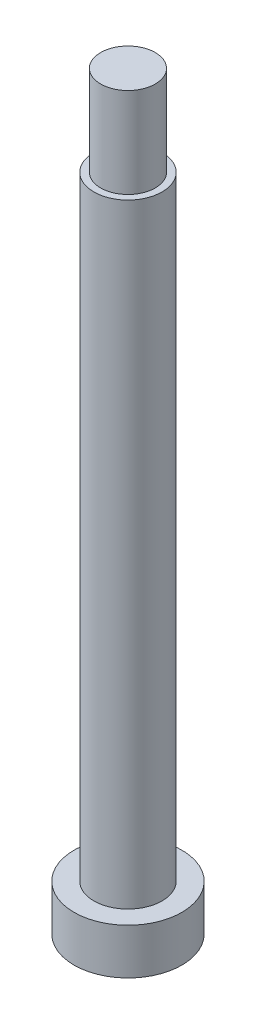
ISO-10303-21;
HEADER;
FILE_DESCRIPTION(('STEP AP214'),'2;1');
FILE_NAME('part.step','',(''),(''),'','','');
FILE_SCHEMA(('AUTOMOTIVE_DESIGN { 1 0 10303 214 1 1 1 1 }'));
ENDSEC;
DATA;
#1=APPLICATION_CONTEXT('core data for automotive mechanical design processes');
#2=APPLICATION_PROTOCOL_DEFINITION('international standard','automotive_design',2000,#1);
#3=PRODUCT_CONTEXT('',#1,'mechanical');
#4=PRODUCT('Part','Part','',(#3));
#5=PRODUCT_RELATED_PRODUCT_CATEGORY('part','',(#4));
#6=PRODUCT_DEFINITION_FORMATION('','',#4);
#7=PRODUCT_DEFINITION_CONTEXT('part definition',#1,'design');
#8=PRODUCT_DEFINITION('design','',#6,#7);
#9=PRODUCT_DEFINITION_SHAPE('','',#8);
#10=(LENGTH_UNIT() NAMED_UNIT(*) SI_UNIT(.MILLI.,.METRE.));
#11=(NAMED_UNIT(*) PLANE_ANGLE_UNIT() SI_UNIT($,.RADIAN.));
#12=(NAMED_UNIT(*) SI_UNIT($,.STERADIAN.) SOLID_ANGLE_UNIT());
#13=UNCERTAINTY_MEASURE_WITH_UNIT(LENGTH_MEASURE(1.E-05),#10,'distance_accuracy_value','');
#14=(GEOMETRIC_REPRESENTATION_CONTEXT(3) GLOBAL_UNCERTAINTY_ASSIGNED_CONTEXT((#13)) GLOBAL_UNIT_ASSIGNED_CONTEXT((#10,
#11,#12)) REPRESENTATION_CONTEXT('',''));
#15=CARTESIAN_POINT('',(0.,0.,0.));
#16=DIRECTION('',(0.,0.,1.));
#17=DIRECTION('',(1.,0.,0.));
#18=AXIS2_PLACEMENT_3D('',#15,#16,#17);
#19=CARTESIAN_POINT('',(0.,109.9,0.));
#20=DIRECTION('',(0.,-1.,0.));
#21=DIRECTION('',(0.,0.,-1.));
#22=AXIS2_PLACEMENT_3D('',#19,#20,#21);
#23=CYLINDRICAL_SURFACE('',#22,4.);
#24=CARTESIAN_POINT('',(0.,96.7,0.));
#25=DIRECTION('',(0.,1.,0.));
#26=DIRECTION('',(0.,0.,1.));
#27=AXIS2_PLACEMENT_3D('',#24,#25,#26);
#28=CIRCLE('',#27,4.);
#29=CARTESIAN_POINT('',(0.,96.7,-4.));
#30=VERTEX_POINT('',#29);
#31=EDGE_CURVE('E158',#30,#30,#28,.T.);
#32=CARTESIAN_POINT('',(0.,109.9,0.));
#33=DIRECTION('',(0.,1.,0.));
#34=DIRECTION('',(0.,0.,1.));
#35=AXIS2_PLACEMENT_3D('',#32,#33,#34);
#36=CIRCLE('',#35,4.);
#37=CARTESIAN_POINT('',(0.,109.9,-4.));
#38=VERTEX_POINT('',#37);
#39=EDGE_CURVE('E12',#38,#38,#36,.T.);
#40=CARTESIAN_POINT('',(0.,96.7,-4.));
#41=CARTESIAN_POINT('',(0.,96.8375,-4.));
#42=CARTESIAN_POINT('',(0.,96.975,-4.));
#43=CARTESIAN_POINT('',(0.,97.25,-4.));
#44=CARTESIAN_POINT('',(0.,97.3875,-4.));
#45=CARTESIAN_POINT('',(0.,97.6625,-4.));
#46=CARTESIAN_POINT('',(0.,97.8,-4.));
#47=CARTESIAN_POINT('',(0.,98.075,-4.));
#48=CARTESIAN_POINT('',(0.,98.2125,-4.));
#49=CARTESIAN_POINT('',(0.,98.4875,-4.));
#50=CARTESIAN_POINT('',(0.,98.625,-4.));
#51=CARTESIAN_POINT('',(0.,98.9,-4.));
#52=CARTESIAN_POINT('',(0.,99.0375,-4.));
#53=CARTESIAN_POINT('',(0.,99.3125,-4.));
#54=CARTESIAN_POINT('',(0.,99.45,-4.));
#55=CARTESIAN_POINT('',(0.,99.725,-4.));
#56=CARTESIAN_POINT('',(0.,99.8625,-4.));
#57=CARTESIAN_POINT('',(0.,100.1375,-4.));
#58=CARTESIAN_POINT('',(0.,100.275,-4.));
#59=CARTESIAN_POINT('',(0.,100.55,-4.));
#60=CARTESIAN_POINT('',(0.,100.6875,-4.));
#61=CARTESIAN_POINT('',(0.,100.9625,-4.));
#62=CARTESIAN_POINT('',(0.,101.1,-4.));
#63=CARTESIAN_POINT('',(0.,101.375,-4.));
#64=CARTESIAN_POINT('',(0.,101.5125,-4.));
#65=CARTESIAN_POINT('',(0.,101.7875,-4.));
#66=CARTESIAN_POINT('',(0.,101.925,-4.));
#67=CARTESIAN_POINT('',(0.,102.2,-4.));
#68=CARTESIAN_POINT('',(0.,102.3375,-4.));
#69=CARTESIAN_POINT('',(0.,102.6125,-4.));
#70=CARTESIAN_POINT('',(0.,102.75,-4.));
#71=CARTESIAN_POINT('',(0.,103.025,-4.));
#72=CARTESIAN_POINT('',(0.,103.1625,-4.));
#73=CARTESIAN_POINT('',(0.,103.4375,-4.));
#74=CARTESIAN_POINT('',(0.,103.575,-4.));
#75=CARTESIAN_POINT('',(0.,103.85,-4.));
#76=CARTESIAN_POINT('',(0.,103.9875,-4.));
#77=CARTESIAN_POINT('',(0.,104.2625,-4.));
#78=CARTESIAN_POINT('',(0.,104.4,-4.));
#79=CARTESIAN_POINT('',(0.,104.675,-4.));
#80=CARTESIAN_POINT('',(0.,104.8125,-4.));
#81=CARTESIAN_POINT('',(0.,105.0875,-4.));
#82=CARTESIAN_POINT('',(0.,105.225,-4.));
#83=CARTESIAN_POINT('',(0.,105.5,-4.));
#84=CARTESIAN_POINT('',(0.,105.6375,-4.));
#85=CARTESIAN_POINT('',(0.,105.9125,-4.));
#86=CARTESIAN_POINT('',(0.,106.05,-4.));
#87=CARTESIAN_POINT('',(0.,106.325,-4.));
#88=CARTESIAN_POINT('',(0.,106.4625,-4.));
#89=CARTESIAN_POINT('',(0.,106.7375,-4.));
#90=CARTESIAN_POINT('',(0.,106.875,-4.));
#91=CARTESIAN_POINT('',(0.,107.15,-4.));
#92=CARTESIAN_POINT('',(0.,107.2875,-4.));
#93=CARTESIAN_POINT('',(0.,107.5625,-4.));
#94=CARTESIAN_POINT('',(0.,107.7,-4.));
#95=CARTESIAN_POINT('',(0.,107.975,-4.));
#96=CARTESIAN_POINT('',(0.,108.1125,-4.));
#97=CARTESIAN_POINT('',(0.,108.3875,-4.));
#98=CARTESIAN_POINT('',(0.,108.525,-4.));
#99=CARTESIAN_POINT('',(0.,108.8,-4.));
#100=CARTESIAN_POINT('',(0.,108.9375,-4.));
#101=CARTESIAN_POINT('',(0.,109.2125,-4.));
#102=CARTESIAN_POINT('',(0.,109.35,-4.));
#103=CARTESIAN_POINT('',(0.,109.625,-4.));
#104=CARTESIAN_POINT('',(0.,109.7625,-4.));
#105=CARTESIAN_POINT('',(0.,109.9,-4.));
#106=B_SPLINE_CURVE_WITH_KNOTS('',3,(#40,#41,#42,#43,#44,#45,#46,#47,#48,#49,#50,#51,#52,#53,
#54,#55,#56,#57,#58,#59,#60,#61,#62,#63,#64,#65,#66,#67,#68,#69,#70,#71,#72,#73,#74,#75,#76,#77,
#78,#79,#80,#81,#82,#83,#84,#85,#86,#87,#88,#89,#90,#91,#92,#93,#94,#95,#96,#97,#98,#99,#100,
#101,#102,#103,#104,#105),.UNSPECIFIED.,.F.,.F.,(4,2,2,2,2,2,2,2,2,2,2,2,2,2,2,2,2,2,2,2,2,2,2,
2,2,2,2,2,2,2,2,2,4),(0.,0.41250000000001,0.825000000000006,1.2375,1.65,2.06250000000001,2.475,
2.8875,3.30000000000001,3.71250000000001,4.125,4.53750000000001,4.95000000000001,
5.36250000000001,5.775,6.18750000000001,6.60000000000001,7.0125,7.425,7.83750000000001,
8.25000000000001,8.6625,9.07500000000001,9.48750000000001,9.90000000000001,10.3125,10.725,
11.1375,11.55,11.9625,12.375,12.7875,13.2),.UNSPECIFIED.);
#107=EDGE_CURVE('BSEAM50',#30,#38,#106,.T.);
#108=ORIENTED_EDGE('',*,*,#31,.T.);
#109=ORIENTED_EDGE('',*,*,#39,.F.);
#110=ORIENTED_EDGE('',*,*,#107,.T.);
#111=ORIENTED_EDGE('',*,*,#107,.F.);
#112=EDGE_LOOP('',(#108,#110,#109,#111));
#113=FACE_BOUND('',#112,.T.);
#114=ADVANCED_FACE('F50',(#113),#23,.T.);
#115=CARTESIAN_POINT('',(0.,109.9,0.));
#116=DIRECTION('',(0.,1.,0.));
#117=DIRECTION('',(0.,0.,1.));
#118=AXIS2_PLACEMENT_3D('',#115,#116,#117);
#119=PLANE('',#118);
#120=ORIENTED_EDGE('',*,*,#39,.T.);
#121=EDGE_LOOP('',(#120));
#122=FACE_BOUND('',#121,.T.);
#123=ADVANCED_FACE('F171',(#122),#119,.T.);
#124=CARTESIAN_POINT('',(0.,96.7,0.));
#125=DIRECTION('',(0.,-1.,0.));
#126=DIRECTION('',(0.,0.,-1.));
#127=AXIS2_PLACEMENT_3D('',#124,#125,#126);
#128=CYLINDRICAL_SURFACE('',#127,5.);
#129=CARTESIAN_POINT('',(0.,6.7,0.));
#130=DIRECTION('',(0.,1.,0.));
#131=DIRECTION('',(0.,0.,1.));
#132=AXIS2_PLACEMENT_3D('',#129,#130,#131);
#133=CIRCLE('',#132,5.);
#134=CARTESIAN_POINT('',(0.,6.7,5.));
#135=VERTEX_POINT('',#134);
#136=EDGE_CURVE('E153',#135,#135,#133,.T.);
#137=ORIENTED_EDGE('',*,*,#136,.T.);
#138=EDGE_LOOP('',(#137));
#139=FACE_BOUND('',#138,.T.);
#140=CARTESIAN_POINT('',(0.,96.7,0.));
#141=DIRECTION('',(0.,1.,0.));
#142=DIRECTION('',(0.,0.,1.));
#143=AXIS2_PLACEMENT_3D('',#140,#141,#142);
#144=CIRCLE('',#143,5.);
#145=CARTESIAN_POINT('',(0.,96.7,5.));
#146=VERTEX_POINT('',#145);
#147=EDGE_CURVE('E53',#146,#146,#144,.T.);
#148=ORIENTED_EDGE('',*,*,#147,.F.);
#149=EDGE_LOOP('',(#148));
#150=FACE_BOUND('',#149,.T.);
#151=ADVANCED_FACE('F169',(#139,#150),#128,.T.);
#152=CARTESIAN_POINT('',(0.,96.7,0.));
#153=DIRECTION('',(0.,1.,0.));
#154=DIRECTION('',(0.,0.,1.));
#155=AXIS2_PLACEMENT_3D('',#152,#153,#154);
#156=PLANE('',#155);
#157=ORIENTED_EDGE('',*,*,#31,.F.);
#158=EDGE_LOOP('',(#157));
#159=FACE_BOUND('',#158,.T.);
#160=ORIENTED_EDGE('',*,*,#147,.T.);
#161=EDGE_LOOP('',(#160));
#162=FACE_BOUND('',#161,.T.);
#163=ADVANCED_FACE('F170',(#159,#162),#156,.T.);
#164=CARTESIAN_POINT('',(0.,6.7,0.));
#165=DIRECTION('',(0.,-1.,0.));
#166=DIRECTION('',(0.,0.,-1.));
#167=AXIS2_PLACEMENT_3D('',#164,#165,#166);
#168=CYLINDRICAL_SURFACE('',#167,7.9);
#169=CARTESIAN_POINT('',(0.,6.7,0.));
#170=DIRECTION('',(0.,1.,0.));
#171=DIRECTION('',(0.,0.,1.));
#172=AXIS2_PLACEMENT_3D('',#169,#170,#171);
#173=CIRCLE('',#172,7.9);
#174=CARTESIAN_POINT('',(0.,6.7,7.9));
#175=VERTEX_POINT('',#174);
#176=EDGE_CURVE('E160',#175,#175,#173,.T.);
#177=ORIENTED_EDGE('',*,*,#176,.F.);
#178=EDGE_LOOP('',(#177));
#179=FACE_BOUND('',#178,.T.);
#180=CARTESIAN_POINT('',(0.,0.,0.));
#181=DIRECTION('',(0.,1.,0.));
#182=DIRECTION('',(0.,0.,1.));
#183=AXIS2_PLACEMENT_3D('',#180,#181,#182);
#184=CIRCLE('',#183,7.9);
#185=CARTESIAN_POINT('',(0.,0.,7.9));
#186=VERTEX_POINT('',#185);
#187=EDGE_CURVE('E150',#186,#186,#184,.T.);
#188=ORIENTED_EDGE('',*,*,#187,.T.);
#189=EDGE_LOOP('',(#188));
#190=FACE_BOUND('',#189,.T.);
#191=ADVANCED_FACE('F178',(#179,#190),#168,.T.);
#192=CARTESIAN_POINT('',(0.,6.7,0.));
#193=DIRECTION('',(0.,1.,0.));
#194=DIRECTION('',(0.,0.,1.));
#195=AXIS2_PLACEMENT_3D('',#192,#193,#194);
#196=PLANE('',#195);
#197=ORIENTED_EDGE('',*,*,#136,.F.);
#198=EDGE_LOOP('',(#197));
#199=FACE_BOUND('',#198,.T.);
#200=ORIENTED_EDGE('',*,*,#176,.T.);
#201=EDGE_LOOP('',(#200));
#202=FACE_BOUND('',#201,.T.);
#203=ADVANCED_FACE('F212',(#199,#202),#196,.T.);
#204=CARTESIAN_POINT('',(0.,0.,0.));
#205=DIRECTION('',(0.,1.,0.));
#206=DIRECTION('',(0.,0.,1.));
#207=AXIS2_PLACEMENT_3D('',#204,#205,#206);
#208=PLANE('',#207);
#209=DIRECTION('',(-0.866025403784439,0.,0.5));
#210=VECTOR('',#209,1.);
#211=CARTESIAN_POINT('',(2.5,0.,1.44337567297406));
#212=LINE('',#211,#210);
#213=CARTESIAN_POINT('',(2.5,0.,1.44337567297406));
#214=VERTEX_POINT('',#213);
#215=CARTESIAN_POINT('',(0.,0.,2.88675134594813));
#216=VERTEX_POINT('',#215);
#217=EDGE_CURVE('E132',#214,#216,#212,.T.);
#218=ORIENTED_EDGE('',*,*,#217,.F.);
#219=DIRECTION('',(0.,0.,1.));
#220=VECTOR('',#219,1.);
#221=CARTESIAN_POINT('',(2.5,0.,-1.44337567297406));
#222=LINE('',#221,#220);
#223=CARTESIAN_POINT('',(2.5,0.,-1.44337567297406));
#224=VERTEX_POINT('',#223);
#225=EDGE_CURVE('E64',#224,#214,#222,.T.);
#226=ORIENTED_EDGE('',*,*,#225,.F.);
#227=DIRECTION('',(0.866025403784439,0.,0.5));
#228=VECTOR('',#227,1.);
#229=CARTESIAN_POINT('',(0.,0.,-2.88675134594813));
#230=LINE('',#229,#228);
#231=CARTESIAN_POINT('',(0.,0.,-2.88675134594813));
#232=VERTEX_POINT('',#231);
#233=EDGE_CURVE('E144',#232,#224,#230,.T.);
#234=ORIENTED_EDGE('',*,*,#233,.F.);
#235=DIRECTION('',(0.866025403784439,0.,-0.5));
#236=VECTOR('',#235,1.);
#237=CARTESIAN_POINT('',(-2.5,0.,-1.44337567297407));
#238=LINE('',#237,#236);
#239=CARTESIAN_POINT('',(-2.5,0.,-1.44337567297407));
#240=VERTEX_POINT('',#239);
#241=EDGE_CURVE('E145',#240,#232,#238,.T.);
#242=ORIENTED_EDGE('',*,*,#241,.F.);
#243=DIRECTION('',(0.,0.,-1.));
#244=VECTOR('',#243,1.);
#245=CARTESIAN_POINT('',(-2.5,0.,1.44337567297406));
#246=LINE('',#245,#244);
#247=CARTESIAN_POINT('',(-2.5,0.,1.44337567297406));
#248=VERTEX_POINT('',#247);
#249=EDGE_CURVE('E107',#248,#240,#246,.T.);
#250=ORIENTED_EDGE('',*,*,#249,.F.);
#251=DIRECTION('',(-0.866025403784439,0.,-0.5));
#252=VECTOR('',#251,1.);
#253=CARTESIAN_POINT('',(0.,0.,2.88675134594813));
#254=LINE('',#253,#252);
#255=EDGE_CURVE('E139',#216,#248,#254,.T.);
#256=ORIENTED_EDGE('',*,*,#255,.F.);
#257=EDGE_LOOP('',(#218,#226,#234,#242,#250,#256));
#258=FACE_BOUND('',#257,.T.);
#259=ORIENTED_EDGE('',*,*,#187,.F.);
#260=EDGE_LOOP('',(#259));
#261=FACE_BOUND('',#260,.T.);
#262=ADVANCED_FACE('F206',(#258,#261),#208,.F.);
#263=CARTESIAN_POINT('',(2.5,3.,-1.44337567297406));
#264=DIRECTION('',(1.,0.,0.));
#265=DIRECTION('',(0.,0.,-1.));
#266=AXIS2_PLACEMENT_3D('',#263,#264,#265);
#267=PLANE('',#266);
#268=ORIENTED_EDGE('',*,*,#225,.T.);
#269=DIRECTION('',(0.,-1.,0.));
#270=VECTOR('',#269,1.);
#271=CARTESIAN_POINT('',(2.5,3.,1.44337567297406));
#272=LINE('',#271,#270);
#273=CARTESIAN_POINT('',(2.5,3.,1.44337567297406));
#274=VERTEX_POINT('',#273);
#275=EDGE_CURVE('E92',#274,#214,#272,.T.);
#276=ORIENTED_EDGE('',*,*,#275,.F.);
#277=DIRECTION('',(0.,0.,1.));
#278=VECTOR('',#277,1.);
#279=CARTESIAN_POINT('',(2.5,3.,-1.44337567297406));
#280=LINE('',#279,#278);
#281=CARTESIAN_POINT('',(2.5,3.,-1.44337567297406));
#282=VERTEX_POINT('',#281);
#283=EDGE_CURVE('E149',#282,#274,#280,.T.);
#284=ORIENTED_EDGE('',*,*,#283,.F.);
#285=DIRECTION('',(0.,-1.,0.));
#286=VECTOR('',#285,1.);
#287=CARTESIAN_POINT('',(2.5,3.,-1.44337567297406));
#288=LINE('',#287,#286);
#289=EDGE_CURVE('E68',#282,#224,#288,.T.);
#290=ORIENTED_EDGE('',*,*,#289,.T.);
#291=EDGE_LOOP('',(#268,#276,#284,#290));
#292=FACE_BOUND('',#291,.T.);
#293=ADVANCED_FACE('F213',(#292),#267,.F.);
#294=CARTESIAN_POINT('',(0.,3.,-2.88675134594813));
#295=DIRECTION('',(0.5,0.,-0.866025403784439));
#296=DIRECTION('',(-0.866025403784439,0.,-0.5));
#297=AXIS2_PLACEMENT_3D('',#294,#295,#296);
#298=PLANE('',#297);
#299=ORIENTED_EDGE('',*,*,#233,.T.);
#300=ORIENTED_EDGE('',*,*,#289,.F.);
#301=DIRECTION('',(0.866025403784439,0.,0.5));
#302=VECTOR('',#301,1.);
#303=CARTESIAN_POINT('',(0.,3.,-2.88675134594813));
#304=LINE('',#303,#302);
#305=CARTESIAN_POINT('',(0.,3.,-2.88675134594813));
#306=VERTEX_POINT('',#305);
#307=EDGE_CURVE('E122',#306,#282,#304,.T.);
#308=ORIENTED_EDGE('',*,*,#307,.F.);
#309=DIRECTION('',(0.,-1.,0.));
#310=VECTOR('',#309,1.);
#311=CARTESIAN_POINT('',(0.,3.,-2.88675134594813));
#312=LINE('',#311,#310);
#313=EDGE_CURVE('E113',#306,#232,#312,.T.);
#314=ORIENTED_EDGE('',*,*,#313,.T.);
#315=EDGE_LOOP('',(#299,#300,#308,#314));
#316=FACE_BOUND('',#315,.T.);
#317=ADVANCED_FACE('F243',(#316),#298,.F.);
#318=CARTESIAN_POINT('',(-2.5,3.,-1.44337567297407));
#319=DIRECTION('',(-0.5,0.,-0.866025403784439));
#320=DIRECTION('',(-0.866025403784439,0.,0.5));
#321=AXIS2_PLACEMENT_3D('',#318,#319,#320);
#322=PLANE('',#321);
#323=ORIENTED_EDGE('',*,*,#241,.T.);
#324=ORIENTED_EDGE('',*,*,#313,.F.);
#325=DIRECTION('',(0.866025403784439,0.,-0.5));
#326=VECTOR('',#325,1.);
#327=CARTESIAN_POINT('',(-2.5,3.,-1.44337567297407));
#328=LINE('',#327,#326);
#329=CARTESIAN_POINT('',(-2.5,3.,-1.44337567297407));
#330=VERTEX_POINT('',#329);
#331=EDGE_CURVE('E120',#330,#306,#328,.T.);
#332=ORIENTED_EDGE('',*,*,#331,.F.);
#333=DIRECTION('',(0.,-1.,0.));
#334=VECTOR('',#333,1.);
#335=CARTESIAN_POINT('',(-2.5,3.,-1.44337567297407));
#336=LINE('',#335,#334);
#337=EDGE_CURVE('E105',#330,#240,#336,.T.);
#338=ORIENTED_EDGE('',*,*,#337,.T.);
#339=EDGE_LOOP('',(#323,#324,#332,#338));
#340=FACE_BOUND('',#339,.T.);
#341=ADVANCED_FACE('F117',(#340),#322,.F.);
#342=CARTESIAN_POINT('',(-2.5,3.,1.44337567297406));
#343=DIRECTION('',(-1.,0.,0.));
#344=DIRECTION('',(0.,0.,1.));
#345=AXIS2_PLACEMENT_3D('',#342,#343,#344);
#346=PLANE('',#345);
#347=ORIENTED_EDGE('',*,*,#249,.T.);
#348=ORIENTED_EDGE('',*,*,#337,.F.);
#349=DIRECTION('',(0.,0.,-1.));
#350=VECTOR('',#349,1.);
#351=CARTESIAN_POINT('',(-2.5,3.,1.44337567297406));
#352=LINE('',#351,#350);
#353=CARTESIAN_POINT('',(-2.5,3.,1.44337567297406));
#354=VERTEX_POINT('',#353);
#355=EDGE_CURVE('E106',#354,#330,#352,.T.);
#356=ORIENTED_EDGE('',*,*,#355,.F.);
#357=DIRECTION('',(0.,-1.,0.));
#358=VECTOR('',#357,1.);
#359=CARTESIAN_POINT('',(-2.5,3.,1.44337567297406));
#360=LINE('',#359,#358);
#361=EDGE_CURVE('E112',#354,#248,#360,.T.);
#362=ORIENTED_EDGE('',*,*,#361,.T.);
#363=EDGE_LOOP('',(#347,#348,#356,#362));
#364=FACE_BOUND('',#363,.T.);
#365=ADVANCED_FACE('F104',(#364),#346,.F.);
#366=CARTESIAN_POINT('',(0.,3.,2.88675134594813));
#367=DIRECTION('',(-0.5,0.,0.866025403784438));
#368=DIRECTION('',(0.866025403784439,0.,0.5));
#369=AXIS2_PLACEMENT_3D('',#366,#367,#368);
#370=PLANE('',#369);
#371=ORIENTED_EDGE('',*,*,#255,.T.);
#372=ORIENTED_EDGE('',*,*,#361,.F.);
#373=DIRECTION('',(-0.866025403784439,0.,-0.5));
#374=VECTOR('',#373,1.);
#375=CARTESIAN_POINT('',(0.,3.,2.88675134594813));
#376=LINE('',#375,#374);
#377=CARTESIAN_POINT('',(0.,3.,2.88675134594813));
#378=VERTEX_POINT('',#377);
#379=EDGE_CURVE('E126',#378,#354,#376,.T.);
#380=ORIENTED_EDGE('',*,*,#379,.F.);
#381=DIRECTION('',(0.,-1.,0.));
#382=VECTOR('',#381,1.);
#383=CARTESIAN_POINT('',(0.,3.,2.88675134594813));
#384=LINE('',#383,#382);
#385=EDGE_CURVE('E154',#378,#216,#384,.T.);
#386=ORIENTED_EDGE('',*,*,#385,.T.);
#387=EDGE_LOOP('',(#371,#372,#380,#386));
#388=FACE_BOUND('',#387,.T.);
#389=ADVANCED_FACE('F263',(#388),#370,.F.);
#390=CARTESIAN_POINT('',(2.5,3.,1.44337567297406));
#391=DIRECTION('',(0.5,0.,0.866025403784438));
#392=DIRECTION('',(0.866025403784439,0.,-0.5));
#393=AXIS2_PLACEMENT_3D('',#390,#391,#392);
#394=PLANE('',#393);
#395=ORIENTED_EDGE('',*,*,#217,.T.);
#396=ORIENTED_EDGE('',*,*,#385,.F.);
#397=DIRECTION('',(-0.866025403784439,0.,0.5));
#398=VECTOR('',#397,1.);
#399=CARTESIAN_POINT('',(2.5,3.,1.44337567297406));
#400=LINE('',#399,#398);
#401=EDGE_CURVE('E128',#274,#378,#400,.T.);
#402=ORIENTED_EDGE('',*,*,#401,.F.);
#403=ORIENTED_EDGE('',*,*,#275,.T.);
#404=EDGE_LOOP('',(#395,#396,#402,#403));
#405=FACE_BOUND('',#404,.T.);
#406=ADVANCED_FACE('F275',(#405),#394,.F.);
#407=CARTESIAN_POINT('',(0.,3.,0.));
#408=DIRECTION('',(0.,-1.,0.));
#409=DIRECTION('',(0.,0.,-1.));
#410=AXIS2_PLACEMENT_3D('',#407,#408,#409);
#411=PLANE('',#410);
#412=ORIENTED_EDGE('',*,*,#283,.T.);
#413=ORIENTED_EDGE('',*,*,#401,.T.);
#414=ORIENTED_EDGE('',*,*,#379,.T.);
#415=ORIENTED_EDGE('',*,*,#355,.T.);
#416=ORIENTED_EDGE('',*,*,#331,.T.);
#417=ORIENTED_EDGE('',*,*,#307,.T.);
#418=EDGE_LOOP('',(#412,#413,#414,#415,#416,#417));
#419=FACE_BOUND('',#418,.T.);
#420=ADVANCED_FACE('F121',(#419),#411,.T.);
#421=CLOSED_SHELL('',(#114,#123,#151,#163,#191,#203,#262,#293,#317,#341,#365,#389,#406,#420));
#422=MANIFOLD_SOLID_BREP('B2',#421);
#423=ADVANCED_BREP_SHAPE_REPRESENTATION('',(#18,#422),#14);
#424=SHAPE_DEFINITION_REPRESENTATION(#9,#423);
ENDSEC;
END-ISO-10303-21;
